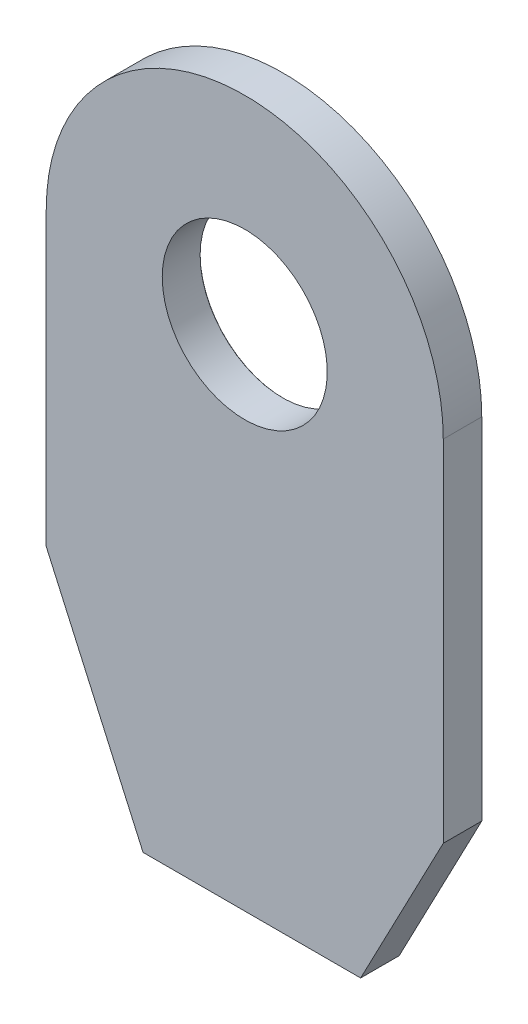
ISO-10303-21;
HEADER;
FILE_DESCRIPTION(('STEP AP214'),'2;1');
FILE_NAME('part.step','',(''),(''),'','','');
FILE_SCHEMA(('AUTOMOTIVE_DESIGN { 1 0 10303 214 1 1 1 1 }'));
ENDSEC;
DATA;
#1=APPLICATION_CONTEXT('core data for automotive mechanical design processes');
#2=APPLICATION_PROTOCOL_DEFINITION('international standard','automotive_design',2000,#1);
#3=PRODUCT_CONTEXT('',#1,'mechanical');
#4=PRODUCT('Part','Part','',(#3));
#5=PRODUCT_RELATED_PRODUCT_CATEGORY('part','',(#4));
#6=PRODUCT_DEFINITION_FORMATION('','',#4);
#7=PRODUCT_DEFINITION_CONTEXT('part definition',#1,'design');
#8=PRODUCT_DEFINITION('design','',#6,#7);
#9=PRODUCT_DEFINITION_SHAPE('','',#8);
#10=(LENGTH_UNIT() NAMED_UNIT(*) SI_UNIT(.MILLI.,.METRE.));
#11=(NAMED_UNIT(*) PLANE_ANGLE_UNIT() SI_UNIT($,.RADIAN.));
#12=(NAMED_UNIT(*) SI_UNIT($,.STERADIAN.) SOLID_ANGLE_UNIT());
#13=UNCERTAINTY_MEASURE_WITH_UNIT(LENGTH_MEASURE(1.E-05),#10,'distance_accuracy_value','');
#14=(GEOMETRIC_REPRESENTATION_CONTEXT(3) GLOBAL_UNCERTAINTY_ASSIGNED_CONTEXT((#13)) GLOBAL_UNIT_ASSIGNED_CONTEXT((#10,
#11,#12)) REPRESENTATION_CONTEXT('',''));
#15=CARTESIAN_POINT('',(0.,0.,0.));
#16=DIRECTION('',(0.,0.,1.));
#17=DIRECTION('',(1.,0.,0.));
#18=AXIS2_PLACEMENT_3D('',#15,#16,#17);
#19=CARTESIAN_POINT('',(-7.939999995,0.,1.54));
#20=DIRECTION('',(1.,0.,0.));
#21=DIRECTION('',(0.,0.,-1.));
#22=AXIS2_PLACEMENT_3D('',#19,#20,#21);
#23=PLANE('',#22);
#24=DIRECTION('',(0.,-1.,0.));
#25=VECTOR('',#24,1.);
#26=CARTESIAN_POINT('',(-7.939999995,0.,0.));
#27=LINE('',#26,#25);
#28=CARTESIAN_POINT('',(-7.939999995,0.,0.));
#29=VERTEX_POINT('',#28);
#30=CARTESIAN_POINT('',(-7.939999995,-11.6613418920943,0.));
#31=VERTEX_POINT('',#30);
#32=EDGE_CURVE('E157',#29,#31,#27,.T.);
#33=ORIENTED_EDGE('',*,*,#32,.T.);
#34=DIRECTION('',(0.,0.,-1.));
#35=VECTOR('',#34,1.);
#36=CARTESIAN_POINT('',(-7.939999995,-11.6613418920943,1.54));
#37=LINE('',#36,#35);
#38=CARTESIAN_POINT('',(-7.939999995,-11.6613418920943,1.54));
#39=VERTEX_POINT('',#38);
#40=EDGE_CURVE('E79',#39,#31,#37,.T.);
#41=ORIENTED_EDGE('',*,*,#40,.F.);
#42=DIRECTION('',(0.,-1.,0.));
#43=VECTOR('',#42,1.);
#44=CARTESIAN_POINT('',(-7.939999995,0.,1.54));
#45=LINE('',#44,#43);
#46=CARTESIAN_POINT('',(-7.939999995,0.,1.54));
#47=VERTEX_POINT('',#46);
#48=EDGE_CURVE('E174',#47,#39,#45,.T.);
#49=ORIENTED_EDGE('',*,*,#48,.F.);
#50=DIRECTION('',(0.,0.,-1.));
#51=VECTOR('',#50,1.);
#52=CARTESIAN_POINT('',(-7.939999995,0.,1.54));
#53=LINE('',#52,#51);
#54=EDGE_CURVE('E12',#47,#29,#53,.T.);
#55=ORIENTED_EDGE('',*,*,#54,.T.);
#56=EDGE_LOOP('',(#33,#41,#49,#55));
#57=FACE_BOUND('',#56,.T.);
#58=ADVANCED_FACE('F68',(#57),#23,.F.);
#59=CARTESIAN_POINT('',(-10.9625330563195,-4.90217480575076,1.54));
#60=DIRECTION('',(-0.9128839325408,-0.408219212811993,0.));
#61=DIRECTION('',(0.408219212811993,-0.9128839325408,0.));
#62=AXIS2_PLACEMENT_3D('',#59,#60,#61);
#63=PLANE('',#62);
#64=DIRECTION('',(-0.408219212811993,0.9128839325408,0.));
#65=VECTOR('',#64,1.);
#66=CARTESIAN_POINT('',(-10.9625330563195,-4.90217480575076,0.));
#67=LINE('',#66,#65);
#68=CARTESIAN_POINT('',(-4.06806132807702,-20.32,0.));
#69=VERTEX_POINT('',#68);
#70=EDGE_CURVE('E161',#69,#31,#67,.T.);
#71=ORIENTED_EDGE('',*,*,#70,.F.);
#72=DIRECTION('',(0.,0.,-1.));
#73=VECTOR('',#72,1.);
#74=CARTESIAN_POINT('',(-4.06806132807702,-20.32,1.54));
#75=LINE('',#74,#73);
#76=CARTESIAN_POINT('',(-4.06806132807702,-20.32,1.54));
#77=VERTEX_POINT('',#76);
#78=EDGE_CURVE('E147',#77,#69,#75,.T.);
#79=ORIENTED_EDGE('',*,*,#78,.F.);
#80=DIRECTION('',(-0.408219212811993,0.9128839325408,0.));
#81=VECTOR('',#80,1.);
#82=CARTESIAN_POINT('',(-10.9625330563195,-4.90217480575076,1.54));
#83=LINE('',#82,#81);
#84=EDGE_CURVE('E134',#77,#39,#83,.T.);
#85=ORIENTED_EDGE('',*,*,#84,.T.);
#86=ORIENTED_EDGE('',*,*,#40,.T.);
#87=EDGE_LOOP('',(#71,#79,#85,#86));
#88=FACE_BOUND('',#87,.T.);
#89=ADVANCED_FACE('F203',(#88),#63,.T.);
#90=CARTESIAN_POINT('',(0.,-20.32,1.54));
#91=DIRECTION('',(0.,1.,0.));
#92=DIRECTION('',(0.,0.,1.));
#93=AXIS2_PLACEMENT_3D('',#90,#91,#92);
#94=PLANE('',#93);
#95=DIRECTION('',(1.,0.,0.));
#96=VECTOR('',#95,1.);
#97=CARTESIAN_POINT('',(0.,-20.32,0.));
#98=LINE('',#97,#96);
#99=CARTESIAN_POINT('',(4.6346404003259,-20.32,0.));
#100=VERTEX_POINT('',#99);
#101=EDGE_CURVE('E142',#69,#100,#98,.T.);
#102=ORIENTED_EDGE('',*,*,#101,.T.);
#103=DIRECTION('',(0.,0.,-1.));
#104=VECTOR('',#103,1.);
#105=CARTESIAN_POINT('',(4.6346404003259,-20.32,1.54));
#106=LINE('',#105,#104);
#107=CARTESIAN_POINT('',(4.6346404003259,-20.32,1.54));
#108=VERTEX_POINT('',#107);
#109=EDGE_CURVE('E139',#108,#100,#106,.T.);
#110=ORIENTED_EDGE('',*,*,#109,.F.);
#111=DIRECTION('',(1.,0.,0.));
#112=VECTOR('',#111,1.);
#113=CARTESIAN_POINT('',(0.,-20.32,1.54));
#114=LINE('',#113,#112);
#115=EDGE_CURVE('E127',#77,#108,#114,.T.);
#116=ORIENTED_EDGE('',*,*,#115,.F.);
#117=ORIENTED_EDGE('',*,*,#78,.T.);
#118=EDGE_LOOP('',(#102,#110,#116,#117));
#119=FACE_BOUND('',#118,.T.);
#120=ADVANCED_FACE('F140',(#119),#94,.F.);
#121=CARTESIAN_POINT('',(11.9846965805975,-6.26931794808426,1.54));
#122=DIRECTION('',(0.886086074364285,-0.463520731810014,0.));
#123=DIRECTION('',(0.463520731810014,0.886086074364285,0.));
#124=AXIS2_PLACEMENT_3D('',#121,#122,#123);
#125=PLANE('',#124);
#126=DIRECTION('',(-0.463520731810014,-0.886086074364285,0.));
#127=VECTOR('',#126,1.);
#128=CARTESIAN_POINT('',(11.9846965805975,-6.26931794808426,0.));
#129=LINE('',#128,#127);
#130=CARTESIAN_POINT('',(7.939999995,-14.0013330955657,0.));
#131=VERTEX_POINT('',#130);
#132=EDGE_CURVE('E168',#131,#100,#129,.T.);
#133=ORIENTED_EDGE('',*,*,#132,.F.);
#134=DIRECTION('',(0.,0.,-1.));
#135=VECTOR('',#134,1.);
#136=CARTESIAN_POINT('',(7.939999995,-14.0013330955657,1.54));
#137=LINE('',#136,#135);
#138=CARTESIAN_POINT('',(7.939999995,-14.0013330955657,1.54));
#139=VERTEX_POINT('',#138);
#140=EDGE_CURVE('E107',#139,#131,#137,.T.);
#141=ORIENTED_EDGE('',*,*,#140,.F.);
#142=DIRECTION('',(-0.463520731810014,-0.886086074364285,0.));
#143=VECTOR('',#142,1.);
#144=CARTESIAN_POINT('',(11.9846965805975,-6.26931794808426,1.54));
#145=LINE('',#144,#143);
#146=EDGE_CURVE('E132',#139,#108,#145,.T.);
#147=ORIENTED_EDGE('',*,*,#146,.T.);
#148=ORIENTED_EDGE('',*,*,#109,.T.);
#149=EDGE_LOOP('',(#133,#141,#147,#148));
#150=FACE_BOUND('',#149,.T.);
#151=ADVANCED_FACE('F149',(#150),#125,.T.);
#152=CARTESIAN_POINT('',(7.939999995,0.,1.54));
#153=DIRECTION('',(-1.,0.,0.));
#154=DIRECTION('',(0.,0.,1.));
#155=AXIS2_PLACEMENT_3D('',#152,#153,#154);
#156=PLANE('',#155);
#157=DIRECTION('',(0.,1.,0.));
#158=VECTOR('',#157,1.);
#159=CARTESIAN_POINT('',(7.939999995,0.,0.));
#160=LINE('',#159,#158);
#161=CARTESIAN_POINT('',(7.939999995,0.,0.));
#162=VERTEX_POINT('',#161);
#163=EDGE_CURVE('E171',#131,#162,#160,.T.);
#164=ORIENTED_EDGE('',*,*,#163,.T.);
#165=DIRECTION('',(0.,0.,-1.));
#166=VECTOR('',#165,1.);
#167=CARTESIAN_POINT('',(7.939999995,0.,1.54));
#168=LINE('',#167,#166);
#169=CARTESIAN_POINT('',(7.939999995,0.,1.54));
#170=VERTEX_POINT('',#169);
#171=EDGE_CURVE('E88',#170,#162,#168,.T.);
#172=ORIENTED_EDGE('',*,*,#171,.F.);
#173=DIRECTION('',(0.,1.,0.));
#174=VECTOR('',#173,1.);
#175=CARTESIAN_POINT('',(7.939999995,0.,1.54));
#176=LINE('',#175,#174);
#177=EDGE_CURVE('E151',#139,#170,#176,.T.);
#178=ORIENTED_EDGE('',*,*,#177,.F.);
#179=ORIENTED_EDGE('',*,*,#140,.T.);
#180=EDGE_LOOP('',(#164,#172,#178,#179));
#181=FACE_BOUND('',#180,.T.);
#182=ADVANCED_FACE('F207',(#181),#156,.F.);
#183=CARTESIAN_POINT('',(0.,0.,0.));
#184=DIRECTION('',(0.,0.,1.));
#185=DIRECTION('',(1.,0.,0.));
#186=AXIS2_PLACEMENT_3D('',#183,#184,#185);
#187=PLANE('',#186);
#188=CARTESIAN_POINT('',(0.,0.,0.));
#189=DIRECTION('',(0.,0.,-1.));
#190=DIRECTION('',(-1.,0.,0.));
#191=AXIS2_PLACEMENT_3D('',#188,#189,#190);
#192=CIRCLE('',#191,3.325);
#193=CARTESIAN_POINT('',(-3.325,0.,0.));
#194=VERTEX_POINT('',#193);
#195=EDGE_CURVE('E195',#194,#194,#192,.T.);
#196=ORIENTED_EDGE('',*,*,#195,.F.);
#197=EDGE_LOOP('',(#196));
#198=FACE_BOUND('',#197,.T.);
#199=ORIENTED_EDGE('',*,*,#32,.F.);
#200=CARTESIAN_POINT('',(0.,0.,0.));
#201=DIRECTION('',(0.,0.,1.));
#202=DIRECTION('',(1.,0.,0.));
#203=AXIS2_PLACEMENT_3D('',#200,#201,#202);
#204=CIRCLE('',#203,7.939999995);
#205=EDGE_CURVE('E72',#162,#29,#204,.T.);
#206=ORIENTED_EDGE('',*,*,#205,.F.);
#207=ORIENTED_EDGE('',*,*,#163,.F.);
#208=ORIENTED_EDGE('',*,*,#132,.T.);
#209=ORIENTED_EDGE('',*,*,#101,.F.);
#210=ORIENTED_EDGE('',*,*,#70,.T.);
#211=EDGE_LOOP('',(#199,#206,#207,#208,#209,#210));
#212=FACE_BOUND('',#211,.T.);
#213=ADVANCED_FACE('F206',(#198,#212),#187,.F.);
#214=CARTESIAN_POINT('',(0.,0.,1.54));
#215=DIRECTION('',(0.,0.,1.));
#216=DIRECTION('',(1.,0.,0.));
#217=AXIS2_PLACEMENT_3D('',#214,#215,#216);
#218=PLANE('',#217);
#219=CARTESIAN_POINT('',(0.,0.,1.54));
#220=DIRECTION('',(0.,0.,-1.));
#221=DIRECTION('',(-1.,0.,0.));
#222=AXIS2_PLACEMENT_3D('',#219,#220,#221);
#223=CIRCLE('',#222,3.3);
#224=CARTESIAN_POINT('',(-3.3,0.,1.54));
#225=VERTEX_POINT('',#224);
#226=EDGE_CURVE('E185',#225,#225,#223,.T.);
#227=ORIENTED_EDGE('',*,*,#226,.T.);
#228=EDGE_LOOP('',(#227));
#229=FACE_BOUND('',#228,.T.);
#230=ORIENTED_EDGE('',*,*,#177,.T.);
#231=CARTESIAN_POINT('',(0.,0.,1.54));
#232=DIRECTION('',(0.,0.,1.));
#233=DIRECTION('',(1.,0.,0.));
#234=AXIS2_PLACEMENT_3D('',#231,#232,#233);
#235=CIRCLE('',#234,7.939999995);
#236=EDGE_CURVE('E162',#170,#47,#235,.T.);
#237=ORIENTED_EDGE('',*,*,#236,.T.);
#238=ORIENTED_EDGE('',*,*,#48,.T.);
#239=ORIENTED_EDGE('',*,*,#84,.F.);
#240=ORIENTED_EDGE('',*,*,#115,.T.);
#241=ORIENTED_EDGE('',*,*,#146,.F.);
#242=EDGE_LOOP('',(#230,#237,#238,#239,#240,#241));
#243=FACE_BOUND('',#242,.T.);
#244=ADVANCED_FACE('F130',(#229,#243),#218,.T.);
#245=CARTESIAN_POINT('',(0.,0.,1.54));
#246=DIRECTION('',(0.,0.,-1.));
#247=DIRECTION('',(-1.,0.,0.));
#248=AXIS2_PLACEMENT_3D('',#245,#246,#247);
#249=CYLINDRICAL_SURFACE('',#248,7.939999995);
#250=ORIENTED_EDGE('',*,*,#205,.T.);
#251=ORIENTED_EDGE('',*,*,#54,.F.);
#252=ORIENTED_EDGE('',*,*,#236,.F.);
#253=ORIENTED_EDGE('',*,*,#171,.T.);
#254=EDGE_LOOP('',(#250,#251,#252,#253));
#255=FACE_BOUND('',#254,.T.);
#256=ADVANCED_FACE('F70',(#255),#249,.T.);
#257=CARTESIAN_POINT('',(0.,0.,0.));
#258=DIRECTION('',(0.,0.,-1.));
#259=DIRECTION('',(-1.,0.,0.));
#260=AXIS2_PLACEMENT_3D('',#257,#258,#259);
#261=CYLINDRICAL_SURFACE('',#260,3.29999999999999);
#262=ORIENTED_EDGE('',*,*,#226,.F.);
#263=EDGE_LOOP('',(#262));
#264=FACE_BOUND('',#263,.T.);
#265=CARTESIAN_POINT('',(0.,0.,0.0249999999999972));
#266=DIRECTION('',(0.,0.,-1.));
#267=DIRECTION('',(-1.,0.,0.));
#268=AXIS2_PLACEMENT_3D('',#265,#266,#267);
#269=CIRCLE('',#268,3.29999999999999);
#270=CARTESIAN_POINT('',(-3.29999999999999,0.,0.0249999999999972));
#271=VERTEX_POINT('',#270);
#272=EDGE_CURVE('E189',#271,#271,#269,.T.);
#273=ORIENTED_EDGE('',*,*,#272,.T.);
#274=EDGE_LOOP('',(#273));
#275=FACE_BOUND('',#274,.T.);
#276=ADVANCED_FACE('F263',(#264,#275),#261,.F.);
#277=CARTESIAN_POINT('',(0.,0.,0.));
#278=DIRECTION('',(0.,0.,-1.));
#279=DIRECTION('',(-1.,0.,0.));
#280=AXIS2_PLACEMENT_3D('',#277,#278,#279);
#281=CONICAL_SURFACE('',#280,3.325,0.785398163397726);
#282=ORIENTED_EDGE('',*,*,#272,.F.);
#283=EDGE_LOOP('',(#282));
#284=FACE_BOUND('',#283,.T.);
#285=ORIENTED_EDGE('',*,*,#195,.T.);
#286=EDGE_LOOP('',(#285));
#287=FACE_BOUND('',#286,.T.);
#288=ADVANCED_FACE('F270',(#284,#287),#281,.F.);
#289=CLOSED_SHELL('',(#58,#89,#120,#151,#182,#213,#244,#256,#276,#288));
#290=MANIFOLD_SOLID_BREP('B2',#289);
#291=ADVANCED_BREP_SHAPE_REPRESENTATION('',(#18,#290),#14);
#292=SHAPE_DEFINITION_REPRESENTATION(#9,#291);
ENDSEC;
END-ISO-10303-21;
